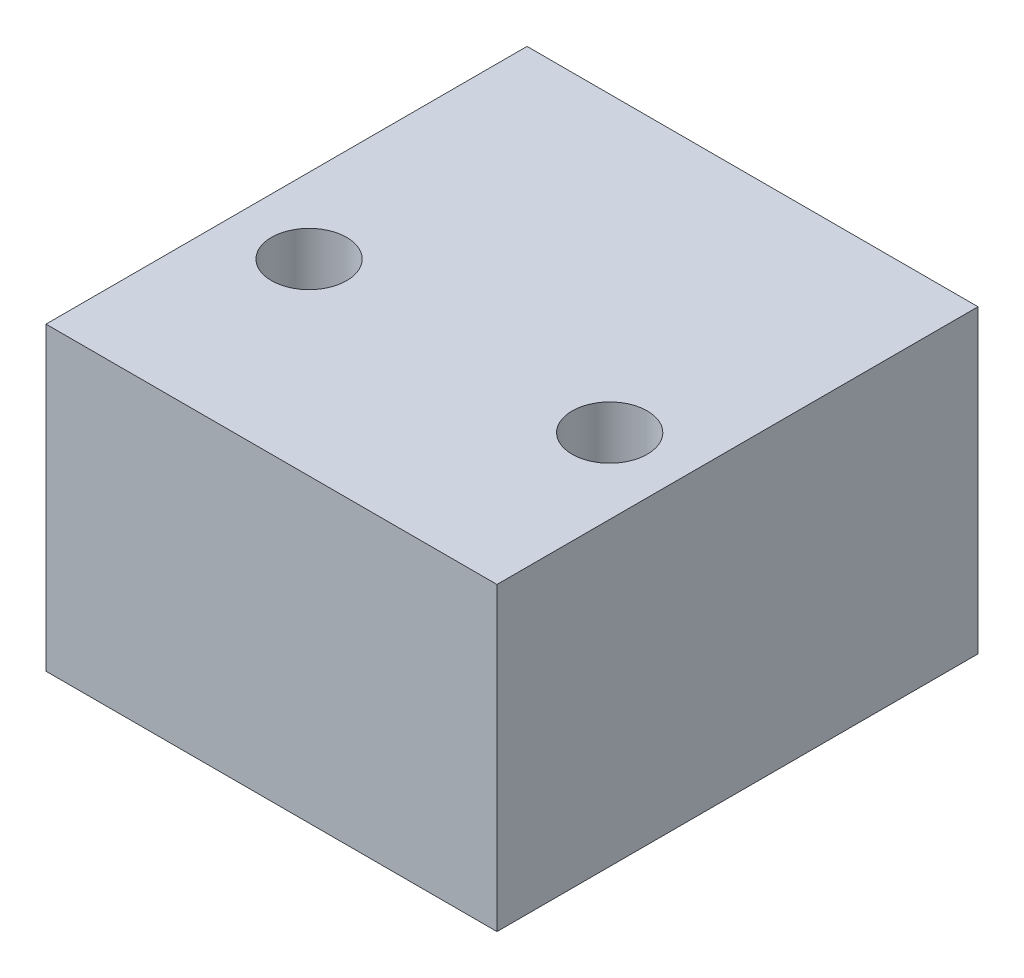
ISO-10303-21;
HEADER;
FILE_DESCRIPTION(('STEP AP214'),'2;1');
FILE_NAME('part.step','',(''),(''),'','','');
FILE_SCHEMA(('AUTOMOTIVE_DESIGN { 1 0 10303 214 1 1 1 1 }'));
ENDSEC;
DATA;
#1=APPLICATION_CONTEXT('core data for automotive mechanical design processes');
#2=APPLICATION_PROTOCOL_DEFINITION('international standard','automotive_design',2000,#1);
#3=PRODUCT_CONTEXT('',#1,'mechanical');
#4=PRODUCT('Part','Part','',(#3));
#5=PRODUCT_RELATED_PRODUCT_CATEGORY('part','',(#4));
#6=PRODUCT_DEFINITION_FORMATION('','',#4);
#7=PRODUCT_DEFINITION_CONTEXT('part definition',#1,'design');
#8=PRODUCT_DEFINITION('design','',#6,#7);
#9=PRODUCT_DEFINITION_SHAPE('','',#8);
#10=(LENGTH_UNIT() NAMED_UNIT(*) SI_UNIT(.MILLI.,.METRE.));
#11=(NAMED_UNIT(*) PLANE_ANGLE_UNIT() SI_UNIT($,.RADIAN.));
#12=(NAMED_UNIT(*) SI_UNIT($,.STERADIAN.) SOLID_ANGLE_UNIT());
#13=UNCERTAINTY_MEASURE_WITH_UNIT(LENGTH_MEASURE(1.E-05),#10,'distance_accuracy_value','');
#14=(GEOMETRIC_REPRESENTATION_CONTEXT(3) GLOBAL_UNCERTAINTY_ASSIGNED_CONTEXT((#13)) GLOBAL_UNIT_ASSIGNED_CONTEXT((#10,
#11,#12)) REPRESENTATION_CONTEXT('',''));
#15=CARTESIAN_POINT('',(0.,0.,0.));
#16=DIRECTION('',(0.,0.,1.));
#17=DIRECTION('',(1.,0.,0.));
#18=AXIS2_PLACEMENT_3D('',#15,#16,#17);
#19=CARTESIAN_POINT('',(15.,20.,0.));
#20=DIRECTION('',(1.,0.,0.));
#21=DIRECTION('',(0.,0.,-1.));
#22=AXIS2_PLACEMENT_3D('',#19,#20,#21);
#23=PLANE('',#22);
#24=DIRECTION('',(0.,0.,1.));
#25=VECTOR('',#24,1.);
#26=CARTESIAN_POINT('',(15.,0.,0.));
#27=LINE('',#26,#25);
#28=CARTESIAN_POINT('',(15.,0.,-19.5));
#29=VERTEX_POINT('',#28);
#30=CARTESIAN_POINT('',(15.,0.,12.5));
#31=VERTEX_POINT('',#30);
#32=EDGE_CURVE('E109',#29,#31,#27,.T.);
#33=ORIENTED_EDGE('',*,*,#32,.F.);
#34=DIRECTION('',(0.,-1.,0.));
#35=VECTOR('',#34,1.);
#36=CARTESIAN_POINT('',(15.,20.,-19.5));
#37=LINE('',#36,#35);
#38=CARTESIAN_POINT('',(15.,20.,-19.5));
#39=VERTEX_POINT('',#38);
#40=EDGE_CURVE('E11',#39,#29,#37,.T.);
#41=ORIENTED_EDGE('',*,*,#40,.F.);
#42=DIRECTION('',(0.,0.,1.));
#43=VECTOR('',#42,1.);
#44=CARTESIAN_POINT('',(15.,20.,0.));
#45=LINE('',#44,#43);
#46=CARTESIAN_POINT('',(15.,20.,12.5));
#47=VERTEX_POINT('',#46);
#48=EDGE_CURVE('E96',#39,#47,#45,.T.);
#49=ORIENTED_EDGE('',*,*,#48,.T.);
#50=DIRECTION('',(0.,-1.,0.));
#51=VECTOR('',#50,1.);
#52=CARTESIAN_POINT('',(15.,20.,12.5));
#53=LINE('',#52,#51);
#54=EDGE_CURVE('E75',#47,#31,#53,.T.);
#55=ORIENTED_EDGE('',*,*,#54,.T.);
#56=EDGE_LOOP('',(#33,#41,#49,#55));
#57=FACE_BOUND('',#56,.T.);
#58=ADVANCED_FACE('F35',(#57),#23,.T.);
#59=CARTESIAN_POINT('',(0.,20.,-19.5));
#60=DIRECTION('',(0.,0.,-1.));
#61=DIRECTION('',(-1.,0.,0.));
#62=AXIS2_PLACEMENT_3D('',#59,#60,#61);
#63=PLANE('',#62);
#64=DIRECTION('',(1.,0.,0.));
#65=VECTOR('',#64,1.);
#66=CARTESIAN_POINT('',(0.,0.,-19.5));
#67=LINE('',#66,#65);
#68=CARTESIAN_POINT('',(-15.,0.,-19.5));
#69=VERTEX_POINT('',#68);
#70=EDGE_CURVE('E87',#69,#29,#67,.T.);
#71=ORIENTED_EDGE('',*,*,#70,.F.);
#72=DIRECTION('',(0.,-1.,0.));
#73=VECTOR('',#72,1.);
#74=CARTESIAN_POINT('',(-15.,20.,-19.5));
#75=LINE('',#74,#73);
#76=CARTESIAN_POINT('',(-15.,20.,-19.5));
#77=VERTEX_POINT('',#76);
#78=EDGE_CURVE('E44',#77,#69,#75,.T.);
#79=ORIENTED_EDGE('',*,*,#78,.F.);
#80=DIRECTION('',(1.,0.,0.));
#81=VECTOR('',#80,1.);
#82=CARTESIAN_POINT('',(0.,20.,-19.5));
#83=LINE('',#82,#81);
#84=EDGE_CURVE('E85',#77,#39,#83,.T.);
#85=ORIENTED_EDGE('',*,*,#84,.T.);
#86=ORIENTED_EDGE('',*,*,#40,.T.);
#87=EDGE_LOOP('',(#71,#79,#85,#86));
#88=FACE_BOUND('',#87,.T.);
#89=ADVANCED_FACE('F83',(#88),#63,.T.);
#90=CARTESIAN_POINT('',(-15.,20.,0.));
#91=DIRECTION('',(1.,0.,0.));
#92=DIRECTION('',(0.,0.,-1.));
#93=AXIS2_PLACEMENT_3D('',#90,#91,#92);
#94=PLANE('',#93);
#95=DIRECTION('',(0.,0.,1.));
#96=VECTOR('',#95,1.);
#97=CARTESIAN_POINT('',(-15.,0.,0.));
#98=LINE('',#97,#96);
#99=CARTESIAN_POINT('',(-15.,0.,12.5));
#100=VERTEX_POINT('',#99);
#101=EDGE_CURVE('E112',#69,#100,#98,.T.);
#102=ORIENTED_EDGE('',*,*,#101,.T.);
#103=DIRECTION('',(0.,-1.,0.));
#104=VECTOR('',#103,1.);
#105=CARTESIAN_POINT('',(-15.,20.,12.5));
#106=LINE('',#105,#104);
#107=CARTESIAN_POINT('',(-15.,20.,12.5));
#108=VERTEX_POINT('',#107);
#109=EDGE_CURVE('E90',#108,#100,#106,.T.);
#110=ORIENTED_EDGE('',*,*,#109,.F.);
#111=DIRECTION('',(0.,0.,1.));
#112=VECTOR('',#111,1.);
#113=CARTESIAN_POINT('',(-15.,20.,0.));
#114=LINE('',#113,#112);
#115=EDGE_CURVE('E92',#77,#108,#114,.T.);
#116=ORIENTED_EDGE('',*,*,#115,.F.);
#117=ORIENTED_EDGE('',*,*,#78,.T.);
#118=EDGE_LOOP('',(#102,#110,#116,#117));
#119=FACE_BOUND('',#118,.T.);
#120=ADVANCED_FACE('F93',(#119),#94,.F.);
#121=CARTESIAN_POINT('',(-10.,20.,0.));
#122=DIRECTION('',(0.,-1.,0.));
#123=DIRECTION('',(0.,0.,-1.));
#124=AXIS2_PLACEMENT_3D('',#121,#122,#123);
#125=CYLINDRICAL_SURFACE('',#124,2.5);
#126=CARTESIAN_POINT('',(-10.,20.,0.));
#127=DIRECTION('',(0.,1.,0.));
#128=DIRECTION('',(0.,0.,1.));
#129=AXIS2_PLACEMENT_3D('',#126,#127,#128);
#130=CIRCLE('',#129,2.5);
#131=CARTESIAN_POINT('',(-10.,20.,2.5));
#132=VERTEX_POINT('',#131);
#133=EDGE_CURVE('E98',#132,#132,#130,.T.);
#134=ORIENTED_EDGE('',*,*,#133,.T.);
#135=EDGE_LOOP('',(#134));
#136=FACE_BOUND('',#135,.T.);
#137=CARTESIAN_POINT('',(-10.,0.,0.));
#138=DIRECTION('',(0.,1.,0.));
#139=DIRECTION('',(0.,0.,1.));
#140=AXIS2_PLACEMENT_3D('',#137,#138,#139);
#141=CIRCLE('',#140,2.5);
#142=CARTESIAN_POINT('',(-10.,0.,2.5));
#143=VERTEX_POINT('',#142);
#144=EDGE_CURVE('E106',#143,#143,#141,.T.);
#145=ORIENTED_EDGE('',*,*,#144,.F.);
#146=EDGE_LOOP('',(#145));
#147=FACE_BOUND('',#146,.T.);
#148=ADVANCED_FACE('F127',(#136,#147),#125,.F.);
#149=CARTESIAN_POINT('',(10.,20.,0.));
#150=DIRECTION('',(0.,-1.,0.));
#151=DIRECTION('',(0.,0.,-1.));
#152=AXIS2_PLACEMENT_3D('',#149,#150,#151);
#153=CYLINDRICAL_SURFACE('',#152,2.5);
#154=CARTESIAN_POINT('',(10.,20.,0.));
#155=DIRECTION('',(0.,1.,0.));
#156=DIRECTION('',(0.,0.,1.));
#157=AXIS2_PLACEMENT_3D('',#154,#155,#156);
#158=CIRCLE('',#157,2.5);
#159=CARTESIAN_POINT('',(10.,20.,2.5));
#160=VERTEX_POINT('',#159);
#161=EDGE_CURVE('E115',#160,#160,#158,.T.);
#162=ORIENTED_EDGE('',*,*,#161,.T.);
#163=EDGE_LOOP('',(#162));
#164=FACE_BOUND('',#163,.T.);
#165=CARTESIAN_POINT('',(10.,0.,0.));
#166=DIRECTION('',(0.,1.,0.));
#167=DIRECTION('',(0.,0.,1.));
#168=AXIS2_PLACEMENT_3D('',#165,#166,#167);
#169=CIRCLE('',#168,2.5);
#170=CARTESIAN_POINT('',(10.,0.,2.5));
#171=VERTEX_POINT('',#170);
#172=EDGE_CURVE('E103',#171,#171,#169,.T.);
#173=ORIENTED_EDGE('',*,*,#172,.F.);
#174=EDGE_LOOP('',(#173));
#175=FACE_BOUND('',#174,.T.);
#176=ADVANCED_FACE('F37',(#164,#175),#153,.F.);
#177=CARTESIAN_POINT('',(0.,20.,12.5));
#178=DIRECTION('',(0.,0.,-1.));
#179=DIRECTION('',(-1.,0.,0.));
#180=AXIS2_PLACEMENT_3D('',#177,#178,#179);
#181=PLANE('',#180);
#182=DIRECTION('',(1.,0.,0.));
#183=VECTOR('',#182,1.);
#184=CARTESIAN_POINT('',(0.,0.,12.5));
#185=LINE('',#184,#183);
#186=EDGE_CURVE('E68',#100,#31,#185,.T.);
#187=ORIENTED_EDGE('',*,*,#186,.T.);
#188=ORIENTED_EDGE('',*,*,#54,.F.);
#189=DIRECTION('',(1.,0.,0.));
#190=VECTOR('',#189,1.);
#191=CARTESIAN_POINT('',(0.,20.,12.5));
#192=LINE('',#191,#190);
#193=EDGE_CURVE('E52',#108,#47,#192,.T.);
#194=ORIENTED_EDGE('',*,*,#193,.F.);
#195=ORIENTED_EDGE('',*,*,#109,.T.);
#196=EDGE_LOOP('',(#187,#188,#194,#195));
#197=FACE_BOUND('',#196,.T.);
#198=ADVANCED_FACE('F118',(#197),#181,.F.);
#199=CARTESIAN_POINT('',(0.,20.,0.));
#200=DIRECTION('',(0.,1.,0.));
#201=DIRECTION('',(0.,0.,1.));
#202=AXIS2_PLACEMENT_3D('',#199,#200,#201);
#203=PLANE('',#202);
#204=ORIENTED_EDGE('',*,*,#161,.F.);
#205=EDGE_LOOP('',(#204));
#206=FACE_BOUND('',#205,.T.);
#207=ORIENTED_EDGE('',*,*,#133,.F.);
#208=EDGE_LOOP('',(#207));
#209=FACE_BOUND('',#208,.T.);
#210=ORIENTED_EDGE('',*,*,#48,.F.);
#211=ORIENTED_EDGE('',*,*,#84,.F.);
#212=ORIENTED_EDGE('',*,*,#115,.T.);
#213=ORIENTED_EDGE('',*,*,#193,.T.);
#214=EDGE_LOOP('',(#210,#211,#212,#213));
#215=FACE_BOUND('',#214,.T.);
#216=ADVANCED_FACE('F95',(#206,#209,#215),#203,.T.);
#217=CARTESIAN_POINT('',(0.,0.,0.));
#218=DIRECTION('',(0.,1.,0.));
#219=DIRECTION('',(0.,0.,1.));
#220=AXIS2_PLACEMENT_3D('',#217,#218,#219);
#221=PLANE('',#220);
#222=ORIENTED_EDGE('',*,*,#172,.T.);
#223=EDGE_LOOP('',(#222));
#224=FACE_BOUND('',#223,.T.);
#225=ORIENTED_EDGE('',*,*,#144,.T.);
#226=EDGE_LOOP('',(#225));
#227=FACE_BOUND('',#226,.T.);
#228=ORIENTED_EDGE('',*,*,#32,.T.);
#229=ORIENTED_EDGE('',*,*,#186,.F.);
#230=ORIENTED_EDGE('',*,*,#101,.F.);
#231=ORIENTED_EDGE('',*,*,#70,.T.);
#232=EDGE_LOOP('',(#228,#229,#230,#231));
#233=FACE_BOUND('',#232,.T.);
#234=ADVANCED_FACE('F119',(#224,#227,#233),#221,.F.);
#235=CLOSED_SHELL('',(#58,#89,#120,#148,#176,#198,#216,#234));
#236=MANIFOLD_SOLID_BREP('B2',#235);
#237=ADVANCED_BREP_SHAPE_REPRESENTATION('',(#18,#236),#14);
#238=SHAPE_DEFINITION_REPRESENTATION(#9,#237);
ENDSEC;
END-ISO-10303-21;
